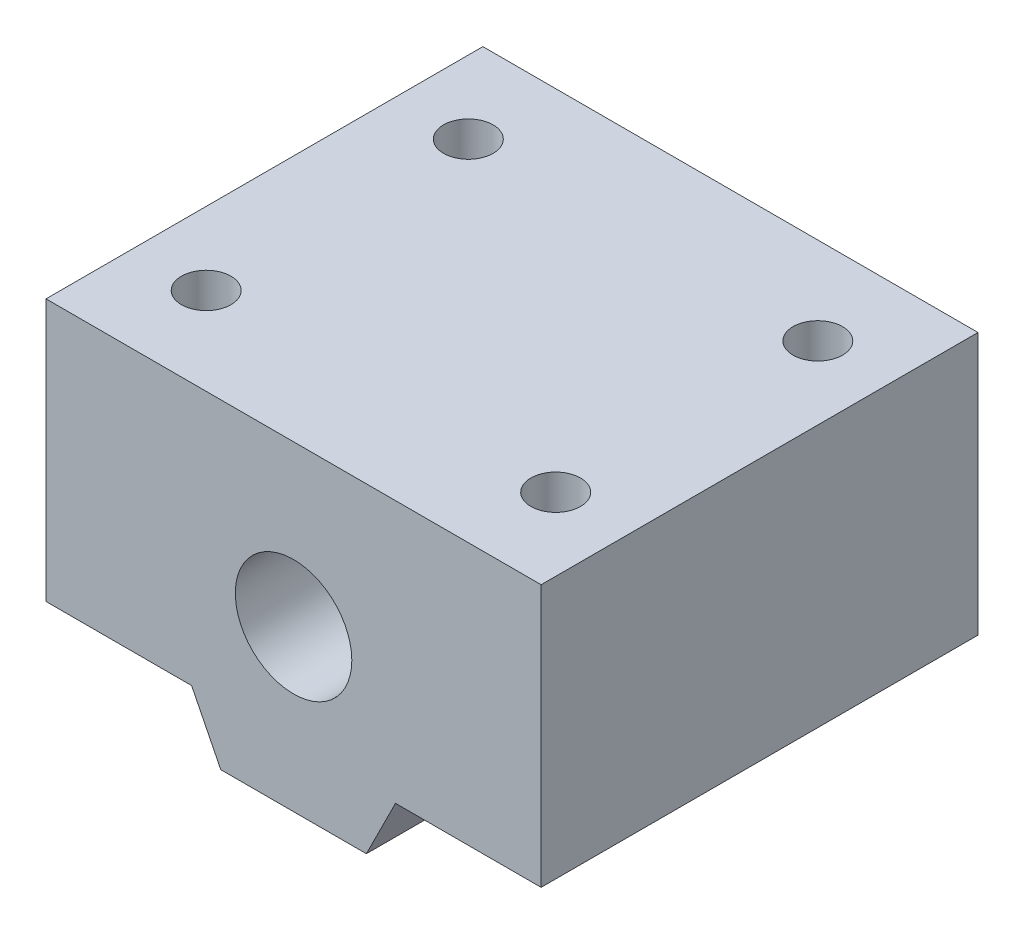
ISO-10303-21;
HEADER;
FILE_DESCRIPTION(('STEP AP214'),'2;1');
FILE_NAME('part.step','',(''),(''),'','','');
FILE_SCHEMA(('AUTOMOTIVE_DESIGN { 1 0 10303 214 1 1 1 1 }'));
ENDSEC;
DATA;
#1=APPLICATION_CONTEXT('core data for automotive mechanical design processes');
#2=APPLICATION_PROTOCOL_DEFINITION('international standard','automotive_design',2000,#1);
#3=PRODUCT_CONTEXT('',#1,'mechanical');
#4=PRODUCT('Part','Part','',(#3));
#5=PRODUCT_RELATED_PRODUCT_CATEGORY('part','',(#4));
#6=PRODUCT_DEFINITION_FORMATION('','',#4);
#7=PRODUCT_DEFINITION_CONTEXT('part definition',#1,'design');
#8=PRODUCT_DEFINITION('design','',#6,#7);
#9=PRODUCT_DEFINITION_SHAPE('','',#8);
#10=(LENGTH_UNIT() NAMED_UNIT(*) SI_UNIT(.MILLI.,.METRE.));
#11=(NAMED_UNIT(*) PLANE_ANGLE_UNIT() SI_UNIT($,.RADIAN.));
#12=(NAMED_UNIT(*) SI_UNIT($,.STERADIAN.) SOLID_ANGLE_UNIT());
#13=UNCERTAINTY_MEASURE_WITH_UNIT(LENGTH_MEASURE(1.E-05),#10,'distance_accuracy_value','');
#14=(GEOMETRIC_REPRESENTATION_CONTEXT(3) GLOBAL_UNCERTAINTY_ASSIGNED_CONTEXT((#13)) GLOBAL_UNIT_ASSIGNED_CONTEXT((#10,
#11,#12)) REPRESENTATION_CONTEXT('',''));
#15=CARTESIAN_POINT('',(0.,0.,0.));
#16=DIRECTION('',(0.,0.,1.));
#17=DIRECTION('',(1.,0.,0.));
#18=AXIS2_PLACEMENT_3D('',#15,#16,#17);
#19=CARTESIAN_POINT('',(12.,-19.,24.));
#20=DIRECTION('',(0.,1.,0.));
#21=DIRECTION('',(0.,0.,1.));
#22=AXIS2_PLACEMENT_3D('',#19,#20,#21);
#23=CYLINDRICAL_SURFACE('',#22,1.7);
#24=CARTESIAN_POINT('',(12.,11.,24.));
#25=DIRECTION('',(0.,1.,0.));
#26=DIRECTION('',(0.,0.,1.));
#27=AXIS2_PLACEMENT_3D('',#24,#25,#26);
#28=CIRCLE('',#27,1.7);
#29=CARTESIAN_POINT('',(12.,11.,25.7));
#30=VERTEX_POINT('',#29);
#31=EDGE_CURVE('E183',#30,#30,#28,.T.);
#32=ORIENTED_EDGE('',*,*,#31,.T.);
#33=EDGE_LOOP('',(#32));
#34=FACE_BOUND('',#33,.T.);
#35=CARTESIAN_POINT('',(12.,-1.,24.));
#36=DIRECTION('',(0.,-1.,0.));
#37=DIRECTION('',(0.,0.,-1.));
#38=AXIS2_PLACEMENT_3D('',#35,#36,#37);
#39=CIRCLE('',#38,1.7);
#40=CARTESIAN_POINT('',(12.,-1.,22.3));
#41=VERTEX_POINT('',#40);
#42=EDGE_CURVE('E45',#41,#41,#39,.F.);
#43=ORIENTED_EDGE('',*,*,#42,.F.);
#44=EDGE_LOOP('',(#43));
#45=FACE_BOUND('',#44,.T.);
#46=ADVANCED_FACE('F41',(#34,#45),#23,.F.);
#47=CARTESIAN_POINT('',(12.,-19.,6.));
#48=DIRECTION('',(0.,1.,0.));
#49=DIRECTION('',(0.,0.,1.));
#50=AXIS2_PLACEMENT_3D('',#47,#48,#49);
#51=CYLINDRICAL_SURFACE('',#50,1.7);
#52=CARTESIAN_POINT('',(12.,11.,6.));
#53=DIRECTION('',(0.,1.,0.));
#54=DIRECTION('',(0.,0.,1.));
#55=AXIS2_PLACEMENT_3D('',#52,#53,#54);
#56=CIRCLE('',#55,1.7);
#57=CARTESIAN_POINT('',(12.,11.,7.7));
#58=VERTEX_POINT('',#57);
#59=EDGE_CURVE('E179',#58,#58,#56,.T.);
#60=ORIENTED_EDGE('',*,*,#59,.T.);
#61=EDGE_LOOP('',(#60));
#62=FACE_BOUND('',#61,.T.);
#63=CARTESIAN_POINT('',(12.,-1.,6.));
#64=DIRECTION('',(0.,-1.,0.));
#65=DIRECTION('',(0.,0.,-1.));
#66=AXIS2_PLACEMENT_3D('',#63,#64,#65);
#67=CIRCLE('',#66,1.7);
#68=CARTESIAN_POINT('',(12.,-1.,4.3));
#69=VERTEX_POINT('',#68);
#70=EDGE_CURVE('E174',#69,#69,#67,.F.);
#71=ORIENTED_EDGE('',*,*,#70,.F.);
#72=EDGE_LOOP('',(#71));
#73=FACE_BOUND('',#72,.T.);
#74=ADVANCED_FACE('F242',(#62,#73),#51,.F.);
#75=CARTESIAN_POINT('',(-12.,-19.,6.));
#76=DIRECTION('',(0.,1.,0.));
#77=DIRECTION('',(0.,0.,1.));
#78=AXIS2_PLACEMENT_3D('',#75,#76,#77);
#79=CYLINDRICAL_SURFACE('',#78,1.7);
#80=CARTESIAN_POINT('',(-12.,11.,6.));
#81=DIRECTION('',(0.,1.,0.));
#82=DIRECTION('',(0.,0.,1.));
#83=AXIS2_PLACEMENT_3D('',#80,#81,#82);
#84=CIRCLE('',#83,1.7);
#85=CARTESIAN_POINT('',(-12.,11.,7.7));
#86=VERTEX_POINT('',#85);
#87=EDGE_CURVE('E192',#86,#86,#84,.T.);
#88=ORIENTED_EDGE('',*,*,#87,.T.);
#89=EDGE_LOOP('',(#88));
#90=FACE_BOUND('',#89,.T.);
#91=CARTESIAN_POINT('',(-12.,-1.,6.));
#92=DIRECTION('',(0.,-1.,0.));
#93=DIRECTION('',(0.,0.,-1.));
#94=AXIS2_PLACEMENT_3D('',#91,#92,#93);
#95=CIRCLE('',#94,1.7);
#96=CARTESIAN_POINT('',(-12.,-1.,4.3));
#97=VERTEX_POINT('',#96);
#98=EDGE_CURVE('E171',#97,#97,#95,.F.);
#99=ORIENTED_EDGE('',*,*,#98,.F.);
#100=EDGE_LOOP('',(#99));
#101=FACE_BOUND('',#100,.T.);
#102=ADVANCED_FACE('F249',(#90,#101),#79,.F.);
#103=CARTESIAN_POINT('',(-12.,-19.,24.));
#104=DIRECTION('',(0.,1.,0.));
#105=DIRECTION('',(0.,0.,1.));
#106=AXIS2_PLACEMENT_3D('',#103,#104,#105);
#107=CYLINDRICAL_SURFACE('',#106,1.7);
#108=CARTESIAN_POINT('',(-12.,11.,24.));
#109=DIRECTION('',(0.,1.,0.));
#110=DIRECTION('',(0.,0.,1.));
#111=AXIS2_PLACEMENT_3D('',#108,#109,#110);
#112=CIRCLE('',#111,1.7);
#113=CARTESIAN_POINT('',(-12.,11.,25.7));
#114=VERTEX_POINT('',#113);
#115=EDGE_CURVE('E188',#114,#114,#112,.T.);
#116=ORIENTED_EDGE('',*,*,#115,.T.);
#117=EDGE_LOOP('',(#116));
#118=FACE_BOUND('',#117,.T.);
#119=CARTESIAN_POINT('',(-12.,-1.,24.));
#120=DIRECTION('',(0.,-1.,0.));
#121=DIRECTION('',(0.,0.,-1.));
#122=AXIS2_PLACEMENT_3D('',#119,#120,#121);
#123=CIRCLE('',#122,1.7);
#124=CARTESIAN_POINT('',(-12.,-1.,22.3));
#125=VERTEX_POINT('',#124);
#126=EDGE_CURVE('E168',#125,#125,#123,.F.);
#127=ORIENTED_EDGE('',*,*,#126,.F.);
#128=EDGE_LOOP('',(#127));
#129=FACE_BOUND('',#128,.T.);
#130=ADVANCED_FACE('F253',(#118,#129),#107,.F.);
#131=CARTESIAN_POINT('',(0.,0.,30.));
#132=DIRECTION('',(0.,0.,-1.));
#133=DIRECTION('',(-1.,0.,0.));
#134=AXIS2_PLACEMENT_3D('',#131,#132,#133);
#135=PLANE('',#134);
#136=DIRECTION('',(0.,1.,0.));
#137=VECTOR('',#136,1.);
#138=CARTESIAN_POINT('',(17.,-7.,30.));
#139=LINE('',#138,#137);
#140=CARTESIAN_POINT('',(17.,-7.,30.));
#141=VERTEX_POINT('',#140);
#142=CARTESIAN_POINT('',(17.,11.,30.));
#143=VERTEX_POINT('',#142);
#144=EDGE_CURVE('E156',#141,#143,#139,.T.);
#145=ORIENTED_EDGE('',*,*,#144,.T.);
#146=DIRECTION('',(-1.,0.,0.));
#147=VECTOR('',#146,1.);
#148=CARTESIAN_POINT('',(-17.,11.,30.));
#149=LINE('',#148,#147);
#150=CARTESIAN_POINT('',(-17.,11.,30.));
#151=VERTEX_POINT('',#150);
#152=EDGE_CURVE('E103',#143,#151,#149,.T.);
#153=ORIENTED_EDGE('',*,*,#152,.T.);
#154=DIRECTION('',(0.,-1.,0.));
#155=VECTOR('',#154,1.);
#156=CARTESIAN_POINT('',(-17.,-7.,30.));
#157=LINE('',#156,#155);
#158=CARTESIAN_POINT('',(-17.,-7.,30.));
#159=VERTEX_POINT('',#158);
#160=EDGE_CURVE('E202',#151,#159,#157,.T.);
#161=ORIENTED_EDGE('',*,*,#160,.T.);
#162=DIRECTION('',(1.,0.,0.));
#163=VECTOR('',#162,1.);
#164=CARTESIAN_POINT('',(-17.,-7.,30.));
#165=LINE('',#164,#163);
#166=CARTESIAN_POINT('',(-7.,-7.,30.));
#167=VERTEX_POINT('',#166);
#168=EDGE_CURVE('E204',#159,#167,#165,.T.);
#169=ORIENTED_EDGE('',*,*,#168,.T.);
#170=DIRECTION('',(0.447213595499958,-0.894427190999916,0.));
#171=VECTOR('',#170,1.);
#172=CARTESIAN_POINT('',(-5.,-11.,30.));
#173=LINE('',#172,#171);
#174=CARTESIAN_POINT('',(-5.,-11.,30.));
#175=VERTEX_POINT('',#174);
#176=EDGE_CURVE('E123',#167,#175,#173,.T.);
#177=ORIENTED_EDGE('',*,*,#176,.T.);
#178=DIRECTION('',(1.,0.,0.));
#179=VECTOR('',#178,1.);
#180=CARTESIAN_POINT('',(-5.,-11.,30.));
#181=LINE('',#180,#179);
#182=CARTESIAN_POINT('',(5.,-11.,30.));
#183=VERTEX_POINT('',#182);
#184=EDGE_CURVE('E116',#175,#183,#181,.T.);
#185=ORIENTED_EDGE('',*,*,#184,.T.);
#186=DIRECTION('',(0.447213595499958,0.894427190999916,0.));
#187=VECTOR('',#186,1.);
#188=CARTESIAN_POINT('',(5.,-11.,30.));
#189=LINE('',#188,#187);
#190=CARTESIAN_POINT('',(7.,-7.,30.));
#191=VERTEX_POINT('',#190);
#192=EDGE_CURVE('E121',#183,#191,#189,.T.);
#193=ORIENTED_EDGE('',*,*,#192,.T.);
#194=DIRECTION('',(1.,0.,0.));
#195=VECTOR('',#194,1.);
#196=CARTESIAN_POINT('',(7.,-7.,30.));
#197=LINE('',#196,#195);
#198=EDGE_CURVE('E60',#191,#141,#197,.T.);
#199=ORIENTED_EDGE('',*,*,#198,.T.);
#200=EDGE_LOOP('',(#145,#153,#161,#169,#177,#185,#193,#199));
#201=FACE_BOUND('',#200,.T.);
#202=CARTESIAN_POINT('',(0.,0.,30.));
#203=DIRECTION('',(0.,0.,1.));
#204=DIRECTION('',(1.,0.,0.));
#205=AXIS2_PLACEMENT_3D('',#202,#203,#204);
#206=CIRCLE('',#205,4.);
#207=CARTESIAN_POINT('',(4.,0.,30.));
#208=VERTEX_POINT('',#207);
#209=EDGE_CURVE('E145',#208,#208,#206,.T.);
#210=ORIENTED_EDGE('',*,*,#209,.F.);
#211=EDGE_LOOP('',(#210));
#212=FACE_BOUND('',#211,.T.);
#213=ADVANCED_FACE('F118',(#201,#212),#135,.F.);
#214=CARTESIAN_POINT('',(0.,0.,0.));
#215=DIRECTION('',(0.,0.,-1.));
#216=DIRECTION('',(-1.,0.,0.));
#217=AXIS2_PLACEMENT_3D('',#214,#215,#216);
#218=PLANE('',#217);
#219=DIRECTION('',(0.,1.,0.));
#220=VECTOR('',#219,1.);
#221=CARTESIAN_POINT('',(17.,-7.,0.));
#222=LINE('',#221,#220);
#223=CARTESIAN_POINT('',(17.,-7.,0.));
#224=VERTEX_POINT('',#223);
#225=CARTESIAN_POINT('',(17.,11.,0.));
#226=VERTEX_POINT('',#225);
#227=EDGE_CURVE('E141',#224,#226,#222,.T.);
#228=ORIENTED_EDGE('',*,*,#227,.F.);
#229=DIRECTION('',(1.,0.,0.));
#230=VECTOR('',#229,1.);
#231=CARTESIAN_POINT('',(7.,-7.,0.));
#232=LINE('',#231,#230);
#233=CARTESIAN_POINT('',(7.,-7.,0.));
#234=VERTEX_POINT('',#233);
#235=EDGE_CURVE('E95',#234,#224,#232,.T.);
#236=ORIENTED_EDGE('',*,*,#235,.F.);
#237=DIRECTION('',(0.447213595499958,0.894427190999916,0.));
#238=VECTOR('',#237,1.);
#239=CARTESIAN_POINT('',(5.,-11.,0.));
#240=LINE('',#239,#238);
#241=CARTESIAN_POINT('',(5.,-11.,0.));
#242=VERTEX_POINT('',#241);
#243=EDGE_CURVE('E89',#242,#234,#240,.T.);
#244=ORIENTED_EDGE('',*,*,#243,.F.);
#245=DIRECTION('',(1.,0.,0.));
#246=VECTOR('',#245,1.);
#247=CARTESIAN_POINT('',(-5.,-11.,0.));
#248=LINE('',#247,#246);
#249=CARTESIAN_POINT('',(-5.,-11.,0.));
#250=VERTEX_POINT('',#249);
#251=EDGE_CURVE('E131',#250,#242,#248,.T.);
#252=ORIENTED_EDGE('',*,*,#251,.F.);
#253=DIRECTION('',(0.447213595499958,-0.894427190999916,0.));
#254=VECTOR('',#253,1.);
#255=CARTESIAN_POINT('',(-5.,-11.,0.));
#256=LINE('',#255,#254);
#257=CARTESIAN_POINT('',(-7.,-7.,0.));
#258=VERTEX_POINT('',#257);
#259=EDGE_CURVE('E151',#258,#250,#256,.T.);
#260=ORIENTED_EDGE('',*,*,#259,.F.);
#261=DIRECTION('',(1.,0.,0.));
#262=VECTOR('',#261,1.);
#263=CARTESIAN_POINT('',(-17.,-7.,0.));
#264=LINE('',#263,#262);
#265=CARTESIAN_POINT('',(-17.,-7.,0.));
#266=VERTEX_POINT('',#265);
#267=EDGE_CURVE('E149',#266,#258,#264,.T.);
#268=ORIENTED_EDGE('',*,*,#267,.F.);
#269=DIRECTION('',(0.,-1.,0.));
#270=VECTOR('',#269,1.);
#271=CARTESIAN_POINT('',(-17.,-7.,0.));
#272=LINE('',#271,#270);
#273=CARTESIAN_POINT('',(-17.,11.,0.));
#274=VERTEX_POINT('',#273);
#275=EDGE_CURVE('E147',#274,#266,#272,.T.);
#276=ORIENTED_EDGE('',*,*,#275,.F.);
#277=DIRECTION('',(-1.,0.,0.));
#278=VECTOR('',#277,1.);
#279=CARTESIAN_POINT('',(-17.,11.,0.));
#280=LINE('',#279,#278);
#281=EDGE_CURVE('E144',#226,#274,#280,.T.);
#282=ORIENTED_EDGE('',*,*,#281,.F.);
#283=EDGE_LOOP('',(#228,#236,#244,#252,#260,#268,#276,#282));
#284=FACE_BOUND('',#283,.T.);
#285=CARTESIAN_POINT('',(0.,0.,0.));
#286=DIRECTION('',(0.,0.,1.));
#287=DIRECTION('',(1.,0.,0.));
#288=AXIS2_PLACEMENT_3D('',#285,#286,#287);
#289=CIRCLE('',#288,4.);
#290=CARTESIAN_POINT('',(4.,0.,0.));
#291=VERTEX_POINT('',#290);
#292=EDGE_CURVE('E195',#291,#291,#289,.T.);
#293=ORIENTED_EDGE('',*,*,#292,.T.);
#294=EDGE_LOOP('',(#293));
#295=FACE_BOUND('',#294,.T.);
#296=ADVANCED_FACE('F217',(#284,#295),#218,.T.);
#297=CARTESIAN_POINT('',(17.,-7.,30.));
#298=DIRECTION('',(-1.,0.,0.));
#299=DIRECTION('',(0.,0.,1.));
#300=AXIS2_PLACEMENT_3D('',#297,#298,#299);
#301=PLANE('',#300);
#302=ORIENTED_EDGE('',*,*,#227,.T.);
#303=DIRECTION('',(0.,0.,-1.));
#304=VECTOR('',#303,1.);
#305=CARTESIAN_POINT('',(17.,11.,30.));
#306=LINE('',#305,#304);
#307=EDGE_CURVE('E11',#143,#226,#306,.T.);
#308=ORIENTED_EDGE('',*,*,#307,.F.);
#309=ORIENTED_EDGE('',*,*,#144,.F.);
#310=DIRECTION('',(0.,0.,-1.));
#311=VECTOR('',#310,1.);
#312=CARTESIAN_POINT('',(17.,-7.,30.));
#313=LINE('',#312,#311);
#314=EDGE_CURVE('E137',#141,#224,#313,.T.);
#315=ORIENTED_EDGE('',*,*,#314,.T.);
#316=EDGE_LOOP('',(#302,#308,#309,#315));
#317=FACE_BOUND('',#316,.T.);
#318=ADVANCED_FACE('F43',(#317),#301,.F.);
#319=CARTESIAN_POINT('',(-17.,11.,30.));
#320=DIRECTION('',(0.,-1.,0.));
#321=DIRECTION('',(0.,0.,-1.));
#322=AXIS2_PLACEMENT_3D('',#319,#320,#321);
#323=PLANE('',#322);
#324=ORIENTED_EDGE('',*,*,#59,.F.);
#325=EDGE_LOOP('',(#324));
#326=FACE_BOUND('',#325,.T.);
#327=ORIENTED_EDGE('',*,*,#31,.F.);
#328=EDGE_LOOP('',(#327));
#329=FACE_BOUND('',#328,.T.);
#330=ORIENTED_EDGE('',*,*,#115,.F.);
#331=EDGE_LOOP('',(#330));
#332=FACE_BOUND('',#331,.T.);
#333=ORIENTED_EDGE('',*,*,#87,.F.);
#334=EDGE_LOOP('',(#333));
#335=FACE_BOUND('',#334,.T.);
#336=ORIENTED_EDGE('',*,*,#281,.T.);
#337=DIRECTION('',(0.,0.,-1.));
#338=VECTOR('',#337,1.);
#339=CARTESIAN_POINT('',(-17.,11.,30.));
#340=LINE('',#339,#338);
#341=EDGE_CURVE('E51',#151,#274,#340,.T.);
#342=ORIENTED_EDGE('',*,*,#341,.F.);
#343=ORIENTED_EDGE('',*,*,#152,.F.);
#344=ORIENTED_EDGE('',*,*,#307,.T.);
#345=EDGE_LOOP('',(#336,#342,#343,#344));
#346=FACE_BOUND('',#345,.T.);
#347=ADVANCED_FACE('F264',(#326,#329,#332,#335,#346),#323,.F.);
#348=CARTESIAN_POINT('',(-17.,-7.,30.));
#349=DIRECTION('',(1.,0.,0.));
#350=DIRECTION('',(0.,0.,-1.));
#351=AXIS2_PLACEMENT_3D('',#348,#349,#350);
#352=PLANE('',#351);
#353=ORIENTED_EDGE('',*,*,#275,.T.);
#354=DIRECTION('',(0.,0.,-1.));
#355=VECTOR('',#354,1.);
#356=CARTESIAN_POINT('',(-17.,-7.,30.));
#357=LINE('',#356,#355);
#358=EDGE_CURVE('E163',#159,#266,#357,.T.);
#359=ORIENTED_EDGE('',*,*,#358,.F.);
#360=ORIENTED_EDGE('',*,*,#160,.F.);
#361=ORIENTED_EDGE('',*,*,#341,.T.);
#362=EDGE_LOOP('',(#353,#359,#360,#361));
#363=FACE_BOUND('',#362,.T.);
#364=ADVANCED_FACE('F268',(#363),#352,.F.);
#365=CARTESIAN_POINT('',(-17.,-7.,30.));
#366=DIRECTION('',(0.,1.,0.));
#367=DIRECTION('',(0.,0.,1.));
#368=AXIS2_PLACEMENT_3D('',#365,#366,#367);
#369=PLANE('',#368);
#370=CARTESIAN_POINT('',(-12.,-7.,6.));
#371=DIRECTION('',(0.,-1.,0.));
#372=DIRECTION('',(0.,0.,-1.));
#373=AXIS2_PLACEMENT_3D('',#370,#371,#372);
#374=CIRCLE('',#373,2.);
#375=CARTESIAN_POINT('',(-12.,-7.,4.));
#376=VERTEX_POINT('',#375);
#377=EDGE_CURVE('E419',#376,#376,#374,.T.);
#378=ORIENTED_EDGE('',*,*,#377,.F.);
#379=EDGE_LOOP('',(#378));
#380=FACE_BOUND('',#379,.T.);
#381=CARTESIAN_POINT('',(-12.,-7.,24.));
#382=DIRECTION('',(0.,-1.,0.));
#383=DIRECTION('',(0.,0.,-1.));
#384=AXIS2_PLACEMENT_3D('',#381,#382,#383);
#385=CIRCLE('',#384,2.);
#386=CARTESIAN_POINT('',(-12.,-7.,22.));
#387=VERTEX_POINT('',#386);
#388=EDGE_CURVE('E407',#387,#387,#385,.T.);
#389=ORIENTED_EDGE('',*,*,#388,.F.);
#390=EDGE_LOOP('',(#389));
#391=FACE_BOUND('',#390,.T.);
#392=ORIENTED_EDGE('',*,*,#267,.T.);
#393=DIRECTION('',(0.,0.,-1.));
#394=VECTOR('',#393,1.);
#395=CARTESIAN_POINT('',(-7.,-7.,30.));
#396=LINE('',#395,#394);
#397=EDGE_CURVE('E160',#167,#258,#396,.T.);
#398=ORIENTED_EDGE('',*,*,#397,.F.);
#399=ORIENTED_EDGE('',*,*,#168,.F.);
#400=ORIENTED_EDGE('',*,*,#358,.T.);
#401=EDGE_LOOP('',(#392,#398,#399,#400));
#402=FACE_BOUND('',#401,.T.);
#403=ADVANCED_FACE('F210',(#380,#391,#402),#369,.F.);
#404=CARTESIAN_POINT('',(-5.,-11.,30.));
#405=DIRECTION('',(0.894427190999916,0.447213595499958,0.));
#406=DIRECTION('',(-0.447213595499958,0.894427190999916,0.));
#407=AXIS2_PLACEMENT_3D('',#404,#405,#406);
#408=PLANE('',#407);
#409=ORIENTED_EDGE('',*,*,#259,.T.);
#410=DIRECTION('',(0.,0.,-1.));
#411=VECTOR('',#410,1.);
#412=CARTESIAN_POINT('',(-5.,-11.,30.));
#413=LINE('',#412,#411);
#414=EDGE_CURVE('E132',#175,#250,#413,.T.);
#415=ORIENTED_EDGE('',*,*,#414,.F.);
#416=ORIENTED_EDGE('',*,*,#176,.F.);
#417=ORIENTED_EDGE('',*,*,#397,.T.);
#418=EDGE_LOOP('',(#409,#415,#416,#417));
#419=FACE_BOUND('',#418,.T.);
#420=ADVANCED_FACE('F214',(#419),#408,.F.);
#421=CARTESIAN_POINT('',(-5.,-11.,30.));
#422=DIRECTION('',(0.,1.,0.));
#423=DIRECTION('',(0.,0.,1.));
#424=AXIS2_PLACEMENT_3D('',#421,#422,#423);
#425=PLANE('',#424);
#426=ORIENTED_EDGE('',*,*,#251,.T.);
#427=DIRECTION('',(0.,0.,-1.));
#428=VECTOR('',#427,1.);
#429=CARTESIAN_POINT('',(5.,-11.,30.));
#430=LINE('',#429,#428);
#431=EDGE_CURVE('E128',#183,#242,#430,.T.);
#432=ORIENTED_EDGE('',*,*,#431,.F.);
#433=ORIENTED_EDGE('',*,*,#184,.F.);
#434=ORIENTED_EDGE('',*,*,#414,.T.);
#435=EDGE_LOOP('',(#426,#432,#433,#434));
#436=FACE_BOUND('',#435,.T.);
#437=ADVANCED_FACE('F129',(#436),#425,.F.);
#438=CARTESIAN_POINT('',(5.,-11.,30.));
#439=DIRECTION('',(-0.894427190999916,0.447213595499958,0.));
#440=DIRECTION('',(-0.447213595499958,-0.894427190999916,0.));
#441=AXIS2_PLACEMENT_3D('',#438,#439,#440);
#442=PLANE('',#441);
#443=ORIENTED_EDGE('',*,*,#243,.T.);
#444=DIRECTION('',(0.,0.,-1.));
#445=VECTOR('',#444,1.);
#446=CARTESIAN_POINT('',(7.,-7.,30.));
#447=LINE('',#446,#445);
#448=EDGE_CURVE('E133',#191,#234,#447,.T.);
#449=ORIENTED_EDGE('',*,*,#448,.F.);
#450=ORIENTED_EDGE('',*,*,#192,.F.);
#451=ORIENTED_EDGE('',*,*,#431,.T.);
#452=EDGE_LOOP('',(#443,#449,#450,#451));
#453=FACE_BOUND('',#452,.T.);
#454=ADVANCED_FACE('F135',(#453),#442,.F.);
#455=CARTESIAN_POINT('',(7.,-7.,30.));
#456=DIRECTION('',(0.,1.,0.));
#457=DIRECTION('',(0.,0.,1.));
#458=AXIS2_PLACEMENT_3D('',#455,#456,#457);
#459=PLANE('',#458);
#460=CARTESIAN_POINT('',(12.,-7.,6.));
#461=DIRECTION('',(0.,-1.,0.));
#462=DIRECTION('',(0.,0.,-1.));
#463=AXIS2_PLACEMENT_3D('',#460,#461,#462);
#464=CIRCLE('',#463,2.);
#465=CARTESIAN_POINT('',(12.,-7.,4.));
#466=VERTEX_POINT('',#465);
#467=EDGE_CURVE('E411',#466,#466,#464,.T.);
#468=ORIENTED_EDGE('',*,*,#467,.F.);
#469=EDGE_LOOP('',(#468));
#470=FACE_BOUND('',#469,.T.);
#471=CARTESIAN_POINT('',(12.,-7.,24.));
#472=DIRECTION('',(0.,-1.,0.));
#473=DIRECTION('',(0.,0.,-1.));
#474=AXIS2_PLACEMENT_3D('',#471,#472,#473);
#475=CIRCLE('',#474,2.);
#476=CARTESIAN_POINT('',(12.,-7.,22.));
#477=VERTEX_POINT('',#476);
#478=EDGE_CURVE('E406',#477,#477,#475,.T.);
#479=ORIENTED_EDGE('',*,*,#478,.F.);
#480=EDGE_LOOP('',(#479));
#481=FACE_BOUND('',#480,.T.);
#482=ORIENTED_EDGE('',*,*,#235,.T.);
#483=ORIENTED_EDGE('',*,*,#314,.F.);
#484=ORIENTED_EDGE('',*,*,#198,.F.);
#485=ORIENTED_EDGE('',*,*,#448,.T.);
#486=EDGE_LOOP('',(#482,#483,#484,#485));
#487=FACE_BOUND('',#486,.T.);
#488=ADVANCED_FACE('F223',(#470,#481,#487),#459,.F.);
#489=CARTESIAN_POINT('',(0.,0.,30.));
#490=DIRECTION('',(0.,0.,-1.));
#491=DIRECTION('',(-1.,0.,0.));
#492=AXIS2_PLACEMENT_3D('',#489,#490,#491);
#493=CYLINDRICAL_SURFACE('',#492,4.);
#494=ORIENTED_EDGE('',*,*,#209,.T.);
#495=EDGE_LOOP('',(#494));
#496=FACE_BOUND('',#495,.T.);
#497=ORIENTED_EDGE('',*,*,#292,.F.);
#498=EDGE_LOOP('',(#497));
#499=FACE_BOUND('',#498,.T.);
#500=ADVANCED_FACE('F225',(#496,#499),#493,.F.);
#501=CARTESIAN_POINT('',(-12.,-1.,24.));
#502=DIRECTION('',(0.,-1.,0.));
#503=DIRECTION('',(0.,0.,-1.));
#504=AXIS2_PLACEMENT_3D('',#501,#502,#503);
#505=PLANE('',#504);
#506=CARTESIAN_POINT('',(-12.,-1.,24.));
#507=DIRECTION('',(0.,-1.,0.));
#508=DIRECTION('',(0.,0.,-1.));
#509=AXIS2_PLACEMENT_3D('',#506,#507,#508);
#510=CIRCLE('',#509,2.);
#511=CARTESIAN_POINT('',(-12.,-1.,22.));
#512=VERTEX_POINT('',#511);
#513=EDGE_CURVE('E172',#512,#512,#510,.T.);
#514=ORIENTED_EDGE('',*,*,#513,.T.);
#515=EDGE_LOOP('',(#514));
#516=FACE_BOUND('',#515,.T.);
#517=ORIENTED_EDGE('',*,*,#126,.T.);
#518=EDGE_LOOP('',(#517));
#519=FACE_BOUND('',#518,.T.);
#520=ADVANCED_FACE('F233',(#516,#519),#505,.T.);
#521=CARTESIAN_POINT('',(-12.,-1.,24.));
#522=DIRECTION('',(0.,-1.,0.));
#523=DIRECTION('',(0.,0.,-1.));
#524=AXIS2_PLACEMENT_3D('',#521,#522,#523);
#525=CYLINDRICAL_SURFACE('',#524,2.);
#526=ORIENTED_EDGE('',*,*,#513,.F.);
#527=EDGE_LOOP('',(#526));
#528=FACE_BOUND('',#527,.T.);
#529=ORIENTED_EDGE('',*,*,#388,.T.);
#530=EDGE_LOOP('',(#529));
#531=FACE_BOUND('',#530,.T.);
#532=ADVANCED_FACE('F328',(#528,#531),#525,.F.);
#533=CARTESIAN_POINT('',(-12.,-1.,6.));
#534=DIRECTION('',(0.,-1.,0.));
#535=DIRECTION('',(0.,0.,-1.));
#536=AXIS2_PLACEMENT_3D('',#533,#534,#535);
#537=PLANE('',#536);
#538=CARTESIAN_POINT('',(-12.,-1.,6.));
#539=DIRECTION('',(0.,-1.,0.));
#540=DIRECTION('',(0.,0.,-1.));
#541=AXIS2_PLACEMENT_3D('',#538,#539,#540);
#542=CIRCLE('',#541,2.);
#543=CARTESIAN_POINT('',(-12.,-1.,4.));
#544=VERTEX_POINT('',#543);
#545=EDGE_CURVE('E422',#544,#544,#542,.T.);
#546=ORIENTED_EDGE('',*,*,#545,.T.);
#547=EDGE_LOOP('',(#546));
#548=FACE_BOUND('',#547,.T.);
#549=ORIENTED_EDGE('',*,*,#98,.T.);
#550=EDGE_LOOP('',(#549));
#551=FACE_BOUND('',#550,.T.);
#552=ADVANCED_FACE('F338',(#548,#551),#537,.T.);
#553=CARTESIAN_POINT('',(-12.,-1.,6.));
#554=DIRECTION('',(0.,-1.,0.));
#555=DIRECTION('',(0.,0.,-1.));
#556=AXIS2_PLACEMENT_3D('',#553,#554,#555);
#557=CYLINDRICAL_SURFACE('',#556,2.);
#558=ORIENTED_EDGE('',*,*,#545,.F.);
#559=EDGE_LOOP('',(#558));
#560=FACE_BOUND('',#559,.T.);
#561=ORIENTED_EDGE('',*,*,#377,.T.);
#562=EDGE_LOOP('',(#561));
#563=FACE_BOUND('',#562,.T.);
#564=ADVANCED_FACE('F347',(#560,#563),#557,.F.);
#565=CARTESIAN_POINT('',(12.,-1.,6.));
#566=DIRECTION('',(0.,-1.,0.));
#567=DIRECTION('',(0.,0.,-1.));
#568=AXIS2_PLACEMENT_3D('',#565,#566,#567);
#569=PLANE('',#568);
#570=CARTESIAN_POINT('',(12.,-1.,6.));
#571=DIRECTION('',(0.,-1.,0.));
#572=DIRECTION('',(0.,0.,-1.));
#573=AXIS2_PLACEMENT_3D('',#570,#571,#572);
#574=CIRCLE('',#573,2.);
#575=CARTESIAN_POINT('',(12.,-1.,4.));
#576=VERTEX_POINT('',#575);
#577=EDGE_CURVE('E416',#576,#576,#574,.T.);
#578=ORIENTED_EDGE('',*,*,#577,.T.);
#579=EDGE_LOOP('',(#578));
#580=FACE_BOUND('',#579,.T.);
#581=ORIENTED_EDGE('',*,*,#70,.T.);
#582=EDGE_LOOP('',(#581));
#583=FACE_BOUND('',#582,.T.);
#584=ADVANCED_FACE('F357',(#580,#583),#569,.T.);
#585=CARTESIAN_POINT('',(12.,-1.,6.));
#586=DIRECTION('',(0.,-1.,0.));
#587=DIRECTION('',(0.,0.,-1.));
#588=AXIS2_PLACEMENT_3D('',#585,#586,#587);
#589=CYLINDRICAL_SURFACE('',#588,2.);
#590=ORIENTED_EDGE('',*,*,#577,.F.);
#591=EDGE_LOOP('',(#590));
#592=FACE_BOUND('',#591,.T.);
#593=ORIENTED_EDGE('',*,*,#467,.T.);
#594=EDGE_LOOP('',(#593));
#595=FACE_BOUND('',#594,.T.);
#596=ADVANCED_FACE('F367',(#592,#595),#589,.F.);
#597=CARTESIAN_POINT('',(12.,-1.,24.));
#598=DIRECTION('',(0.,-1.,0.));
#599=DIRECTION('',(0.,0.,-1.));
#600=AXIS2_PLACEMENT_3D('',#597,#598,#599);
#601=PLANE('',#600);
#602=CARTESIAN_POINT('',(12.,-1.,24.));
#603=DIRECTION('',(0.,-1.,0.));
#604=DIRECTION('',(0.,0.,-1.));
#605=AXIS2_PLACEMENT_3D('',#602,#603,#604);
#606=CIRCLE('',#605,2.);
#607=CARTESIAN_POINT('',(12.,-1.,22.));
#608=VERTEX_POINT('',#607);
#609=EDGE_CURVE('E403',#608,#608,#606,.T.);
#610=ORIENTED_EDGE('',*,*,#609,.T.);
#611=EDGE_LOOP('',(#610));
#612=FACE_BOUND('',#611,.T.);
#613=ORIENTED_EDGE('',*,*,#42,.T.);
#614=EDGE_LOOP('',(#613));
#615=FACE_BOUND('',#614,.T.);
#616=ADVANCED_FACE('F377',(#612,#615),#601,.T.);
#617=CARTESIAN_POINT('',(12.,-1.,24.));
#618=DIRECTION('',(0.,-1.,0.));
#619=DIRECTION('',(0.,0.,-1.));
#620=AXIS2_PLACEMENT_3D('',#617,#618,#619);
#621=CYLINDRICAL_SURFACE('',#620,2.);
#622=ORIENTED_EDGE('',*,*,#609,.F.);
#623=EDGE_LOOP('',(#622));
#624=FACE_BOUND('',#623,.T.);
#625=ORIENTED_EDGE('',*,*,#478,.T.);
#626=EDGE_LOOP('',(#625));
#627=FACE_BOUND('',#626,.T.);
#628=ADVANCED_FACE('F387',(#624,#627),#621,.F.);
#629=CLOSED_SHELL('',(#46,#74,#102,#130,#213,#296,#318,#347,#364,#403,#420,#437,#454,#488,#500,
#520,#532,#552,#564,#584,#596,#616,#628));
#630=MANIFOLD_SOLID_BREP('B2',#629);
#631=ADVANCED_BREP_SHAPE_REPRESENTATION('',(#18,#630),#14);
#632=SHAPE_DEFINITION_REPRESENTATION(#9,#631);
ENDSEC;
END-ISO-10303-21;
